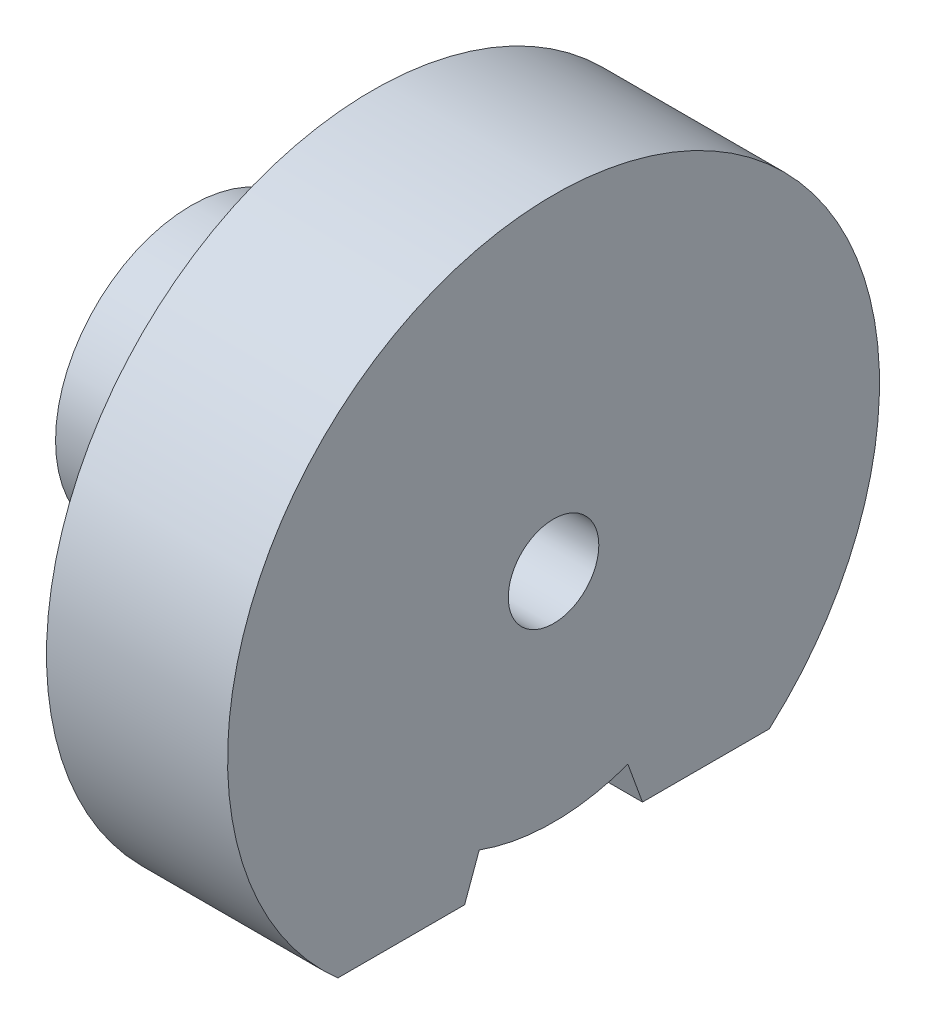
ISO-10303-21;
HEADER;
FILE_DESCRIPTION(('STEP AP214'),'2;1');
FILE_NAME('part.step','',(''),(''),'','','');
FILE_SCHEMA(('AUTOMOTIVE_DESIGN { 1 0 10303 214 1 1 1 1 }'));
ENDSEC;
DATA;
#1=APPLICATION_CONTEXT('core data for automotive mechanical design processes');
#2=APPLICATION_PROTOCOL_DEFINITION('international standard','automotive_design',2000,#1);
#3=PRODUCT_CONTEXT('',#1,'mechanical');
#4=PRODUCT('Part','Part','',(#3));
#5=PRODUCT_RELATED_PRODUCT_CATEGORY('part','',(#4));
#6=PRODUCT_DEFINITION_FORMATION('','',#4);
#7=PRODUCT_DEFINITION_CONTEXT('part definition',#1,'design');
#8=PRODUCT_DEFINITION('design','',#6,#7);
#9=PRODUCT_DEFINITION_SHAPE('','',#8);
#10=(LENGTH_UNIT() NAMED_UNIT(*) SI_UNIT(.MILLI.,.METRE.));
#11=(NAMED_UNIT(*) PLANE_ANGLE_UNIT() SI_UNIT($,.RADIAN.));
#12=(NAMED_UNIT(*) SI_UNIT($,.STERADIAN.) SOLID_ANGLE_UNIT());
#13=UNCERTAINTY_MEASURE_WITH_UNIT(LENGTH_MEASURE(1.E-05),#10,'distance_accuracy_value','');
#14=(GEOMETRIC_REPRESENTATION_CONTEXT(3) GLOBAL_UNCERTAINTY_ASSIGNED_CONTEXT((#13)) GLOBAL_UNIT_ASSIGNED_CONTEXT((#10,
#11,#12)) REPRESENTATION_CONTEXT('',''));
#15=CARTESIAN_POINT('',(0.,0.,0.));
#16=DIRECTION('',(0.,0.,1.));
#17=DIRECTION('',(1.,0.,0.));
#18=AXIS2_PLACEMENT_3D('',#15,#16,#17);
#19=CARTESIAN_POINT('',(-5.,0.,0.));
#20=DIRECTION('',(-1.,0.,0.));
#21=DIRECTION('',(0.,-1.,0.));
#22=AXIS2_PLACEMENT_3D('',#19,#20,#21);
#23=PLANE('',#22);
#24=CARTESIAN_POINT('',(-4.99999999999999,-12.,0.));
#25=DIRECTION('',(-1.,0.,0.));
#26=DIRECTION('',(0.,-1.,0.));
#27=AXIS2_PLACEMENT_3D('',#24,#25,#26);
#28=CIRCLE('',#27,9.5);
#29=CARTESIAN_POINT('',(-4.99999999999999,-21.5,0.));
#30=VERTEX_POINT('',#29);
#31=EDGE_CURVE('E11',#30,#30,#28,.F.);
#32=ORIENTED_EDGE('',*,*,#31,.T.);
#33=EDGE_LOOP('',(#32));
#34=FACE_BOUND('',#33,.T.);
#35=DIRECTION('',(0.,-0.939692620785911,0.342020143325661));
#36=VECTOR('',#35,1.);
#37=CARTESIAN_POINT('',(-5.,-23.276311449431,4.10424171990794));
#38=LINE('',#37,#36);
#39=CARTESIAN_POINT('',(-5.,-23.2763114494309,4.10424171990793));
#40=VERTEX_POINT('',#39);
#41=CARTESIAN_POINT('',(-4.99999999999999,-25.4942657408898,4.91151106296191));
#42=VERTEX_POINT('',#41);
#43=EDGE_CURVE('E123',#40,#42,#38,.T.);
#44=ORIENTED_EDGE('',*,*,#43,.T.);
#45=DIRECTION('',(0.,0.,-1.));
#46=VECTOR('',#45,1.);
#47=CARTESIAN_POINT('',(-4.99999999999999,-25.4942657408898,1.389771851223E-13));
#48=LINE('',#47,#46);
#49=CARTESIAN_POINT('',(-4.99999999999998,-25.4942657408897,11.912379783832));
#50=VERTEX_POINT('',#49);
#51=EDGE_CURVE('E167',#42,#50,#48,.F.);
#52=ORIENTED_EDGE('',*,*,#51,.T.);
#53=CARTESIAN_POINT('',(-4.99999999999998,-12.,0.));
#54=DIRECTION('',(1.,0.,0.));
#55=DIRECTION('',(0.,1.,0.));
#56=AXIS2_PLACEMENT_3D('',#53,#54,#55);
#57=CIRCLE('',#56,18.);
#58=CARTESIAN_POINT('',(-4.99999999999998,-25.4942657408898,-11.912379783832));
#59=VERTEX_POINT('',#58);
#60=EDGE_CURVE('E143',#59,#50,#57,.T.);
#61=ORIENTED_EDGE('',*,*,#60,.F.);
#62=DIRECTION('',(0.,0.,-1.));
#63=VECTOR('',#62,1.);
#64=CARTESIAN_POINT('',(-4.99999999999999,-25.4942657408898,-1.389771851223E-13));
#65=LINE('',#64,#63);
#66=CARTESIAN_POINT('',(-4.99999999999999,-25.4942657408898,-4.91151106296191));
#67=VERTEX_POINT('',#66);
#68=EDGE_CURVE('E160',#59,#67,#65,.F.);
#69=ORIENTED_EDGE('',*,*,#68,.T.);
#70=DIRECTION('',(0.,-0.939692620785911,-0.342020143325661));
#71=VECTOR('',#70,1.);
#72=CARTESIAN_POINT('',(-5.,-23.276311449431,-4.10424171990794));
#73=LINE('',#72,#71);
#74=CARTESIAN_POINT('',(-5.,-23.2763114494309,-4.10424171990793));
#75=VERTEX_POINT('',#74);
#76=EDGE_CURVE('E137',#75,#67,#73,.T.);
#77=ORIENTED_EDGE('',*,*,#76,.F.);
#78=CARTESIAN_POINT('',(-5.,-12.,0.));
#79=DIRECTION('',(1.,0.,0.));
#80=DIRECTION('',(0.,1.,0.));
#81=AXIS2_PLACEMENT_3D('',#78,#79,#80);
#82=CIRCLE('',#81,12.);
#83=EDGE_CURVE('E112',#40,#75,#82,.T.);
#84=ORIENTED_EDGE('',*,*,#83,.F.);
#85=EDGE_LOOP('',(#44,#52,#61,#69,#77,#84));
#86=FACE_BOUND('',#85,.T.);
#87=ADVANCED_FACE('F37',(#34,#86),#23,.T.);
#88=CARTESIAN_POINT('',(5.00000000000001,-12.,0.));
#89=DIRECTION('',(1.,0.,0.));
#90=DIRECTION('',(0.,1.,0.));
#91=AXIS2_PLACEMENT_3D('',#88,#89,#90);
#92=CYLINDRICAL_SURFACE('',#91,12.);
#93=ORIENTED_EDGE('',*,*,#83,.T.);
#94=DIRECTION('',(-1.,0.,0.));
#95=VECTOR('',#94,1.);
#96=CARTESIAN_POINT('',(0.,-23.2763114494309,-4.10424171990793));
#97=LINE('',#96,#95);
#98=CARTESIAN_POINT('',(-1.99999999999999,-23.2763114494309,-4.10424171990793));
#99=VERTEX_POINT('',#98);
#100=EDGE_CURVE('E140',#99,#75,#97,.T.);
#101=ORIENTED_EDGE('',*,*,#100,.F.);
#102=CARTESIAN_POINT('',(-2.,-12.,0.));
#103=DIRECTION('',(1.,0.,0.));
#104=DIRECTION('',(0.,1.,0.));
#105=AXIS2_PLACEMENT_3D('',#102,#103,#104);
#106=CIRCLE('',#105,12.);
#107=CARTESIAN_POINT('',(-1.99999999999999,-23.2763114494309,4.10424171990793));
#108=VERTEX_POINT('',#107);
#109=EDGE_CURVE('E150',#108,#99,#106,.T.);
#110=ORIENTED_EDGE('',*,*,#109,.F.);
#111=DIRECTION('',(-1.,0.,0.));
#112=VECTOR('',#111,1.);
#113=CARTESIAN_POINT('',(0.,-23.2763114494309,4.10424171990793));
#114=LINE('',#113,#112);
#115=EDGE_CURVE('E125',#108,#40,#114,.T.);
#116=ORIENTED_EDGE('',*,*,#115,.T.);
#117=EDGE_LOOP('',(#93,#101,#110,#116));
#118=FACE_BOUND('',#117,.T.);
#119=ADVANCED_FACE('F215',(#118),#92,.T.);
#120=CARTESIAN_POINT('',(5.00000000000001,-12.,0.));
#121=DIRECTION('',(1.,0.,0.));
#122=DIRECTION('',(0.,1.,0.));
#123=AXIS2_PLACEMENT_3D('',#120,#121,#122);
#124=CYLINDRICAL_SURFACE('',#123,12.);
#125=CARTESIAN_POINT('',(2.,-12.,0.));
#126=DIRECTION('',(1.,0.,0.));
#127=DIRECTION('',(0.,1.,0.));
#128=AXIS2_PLACEMENT_3D('',#125,#126,#127);
#129=CIRCLE('',#128,12.);
#130=CARTESIAN_POINT('',(2.00000000000001,-23.2763114494309,4.10424171990793));
#131=VERTEX_POINT('',#130);
#132=CARTESIAN_POINT('',(2.00000000000001,-23.2763114494309,-4.10424171990793));
#133=VERTEX_POINT('',#132);
#134=EDGE_CURVE('E113',#131,#133,#129,.T.);
#135=ORIENTED_EDGE('',*,*,#134,.T.);
#136=DIRECTION('',(-1.,0.,0.));
#137=VECTOR('',#136,1.);
#138=CARTESIAN_POINT('',(0.,-23.2763114494309,-4.10424171990793));
#139=LINE('',#138,#137);
#140=CARTESIAN_POINT('',(5.00000000000001,-23.2763114494309,-4.10424171990793));
#141=VERTEX_POINT('',#140);
#142=EDGE_CURVE('E109',#141,#133,#139,.T.);
#143=ORIENTED_EDGE('',*,*,#142,.F.);
#144=CARTESIAN_POINT('',(5.00000000000001,-12.,0.));
#145=DIRECTION('',(1.,0.,0.));
#146=DIRECTION('',(0.,1.,0.));
#147=AXIS2_PLACEMENT_3D('',#144,#145,#146);
#148=CIRCLE('',#147,12.);
#149=CARTESIAN_POINT('',(5.00000000000001,-23.2763114494309,4.10424171990793));
#150=VERTEX_POINT('',#149);
#151=EDGE_CURVE('E103',#150,#141,#148,.T.);
#152=ORIENTED_EDGE('',*,*,#151,.F.);
#153=DIRECTION('',(-1.,0.,0.));
#154=VECTOR('',#153,1.);
#155=CARTESIAN_POINT('',(0.,-23.2763114494309,4.10424171990793));
#156=LINE('',#155,#154);
#157=EDGE_CURVE('E106',#150,#131,#156,.T.);
#158=ORIENTED_EDGE('',*,*,#157,.T.);
#159=EDGE_LOOP('',(#135,#143,#152,#158));
#160=FACE_BOUND('',#159,.T.);
#161=ADVANCED_FACE('F105',(#160),#124,.T.);
#162=CARTESIAN_POINT('',(0.,-12.,0.));
#163=DIRECTION('',(1.,0.,0.));
#164=DIRECTION('',(0.,1.,0.));
#165=AXIS2_PLACEMENT_3D('',#162,#163,#164);
#166=TOROIDAL_SURFACE('',#165,12.,2.);
#167=ORIENTED_EDGE('',*,*,#109,.T.);
#168=CARTESIAN_POINT('',(0.,-23.2763114494309,-4.10424171990793));
#169=DIRECTION('',(0.,0.342020143325661,-0.939692620785911));
#170=DIRECTION('',(1.,0.,0.));
#171=AXIS2_PLACEMENT_3D('',#168,#169,#170);
#172=CIRCLE('',#171,2.);
#173=EDGE_CURVE('E131',#133,#99,#172,.T.);
#174=ORIENTED_EDGE('',*,*,#173,.F.);
#175=ORIENTED_EDGE('',*,*,#134,.F.);
#176=CARTESIAN_POINT('',(0.,-23.2763114494309,4.10424171990793));
#177=DIRECTION('',(0.,-0.342020143325661,-0.939692620785911));
#178=DIRECTION('',(1.,0.,0.));
#179=AXIS2_PLACEMENT_3D('',#176,#177,#178);
#180=CIRCLE('',#179,2.);
#181=EDGE_CURVE('E120',#131,#108,#180,.T.);
#182=ORIENTED_EDGE('',*,*,#181,.T.);
#183=EDGE_LOOP('',(#167,#174,#175,#182));
#184=FACE_BOUND('',#183,.T.);
#185=ADVANCED_FACE('F214',(#184),#166,.F.);
#186=CARTESIAN_POINT('',(5.00000000000001,0.,0.));
#187=DIRECTION('',(-1.,0.,0.));
#188=DIRECTION('',(0.,-1.,0.));
#189=AXIS2_PLACEMENT_3D('',#186,#187,#188);
#190=PLANE('',#189);
#191=CARTESIAN_POINT('',(5.00000000000001,-12.,0.));
#192=DIRECTION('',(1.,0.,0.));
#193=DIRECTION('',(0.,0.,-1.));
#194=AXIS2_PLACEMENT_3D('',#191,#192,#193);
#195=CIRCLE('',#194,2.5);
#196=CARTESIAN_POINT('',(5.00000000000001,-12.,-2.5));
#197=VERTEX_POINT('',#196);
#198=EDGE_CURVE('E250',#197,#197,#195,.T.);
#199=ORIENTED_EDGE('',*,*,#198,.F.);
#200=EDGE_LOOP('',(#199));
#201=FACE_BOUND('',#200,.T.);
#202=CARTESIAN_POINT('',(4.99999999999999,-12.,0.));
#203=DIRECTION('',(1.,0.,0.));
#204=DIRECTION('',(0.,1.,0.));
#205=AXIS2_PLACEMENT_3D('',#202,#203,#204);
#206=CIRCLE('',#205,18.);
#207=CARTESIAN_POINT('',(5.,-25.4942657408897,-11.912379783832));
#208=VERTEX_POINT('',#207);
#209=CARTESIAN_POINT('',(5.,-25.4942657408897,11.912379783832));
#210=VERTEX_POINT('',#209);
#211=EDGE_CURVE('E146',#208,#210,#206,.T.);
#212=ORIENTED_EDGE('',*,*,#211,.T.);
#213=DIRECTION('',(0.,0.,1.));
#214=VECTOR('',#213,1.);
#215=CARTESIAN_POINT('',(5.00000000000002,-25.4942657408897,11.912379783832));
#216=LINE('',#215,#214);
#217=CARTESIAN_POINT('',(5.00000000000001,-25.4942657408898,4.91151106296191));
#218=VERTEX_POINT('',#217);
#219=EDGE_CURVE('E60',#210,#218,#216,.F.);
#220=ORIENTED_EDGE('',*,*,#219,.T.);
#221=DIRECTION('',(0.,-0.939692620785911,0.342020143325661));
#222=VECTOR('',#221,1.);
#223=CARTESIAN_POINT('',(5.00000000000001,-23.276311449431,4.10424171990794));
#224=LINE('',#223,#222);
#225=EDGE_CURVE('E117',#150,#218,#224,.T.);
#226=ORIENTED_EDGE('',*,*,#225,.F.);
#227=ORIENTED_EDGE('',*,*,#151,.T.);
#228=DIRECTION('',(0.,-0.939692620785911,-0.342020143325661));
#229=VECTOR('',#228,1.);
#230=CARTESIAN_POINT('',(5.00000000000001,-23.2763114494309,-4.10424171990794));
#231=LINE('',#230,#229);
#232=CARTESIAN_POINT('',(5.00000000000001,-25.4942657408898,-4.91151106296192));
#233=VERTEX_POINT('',#232);
#234=EDGE_CURVE('E135',#141,#233,#231,.T.);
#235=ORIENTED_EDGE('',*,*,#234,.T.);
#236=DIRECTION('',(0.,0.,1.));
#237=VECTOR('',#236,1.);
#238=CARTESIAN_POINT('',(5.00000000000002,-25.4942657408898,-4.91151106296192));
#239=LINE('',#238,#237);
#240=EDGE_CURVE('E156',#233,#208,#239,.F.);
#241=ORIENTED_EDGE('',*,*,#240,.T.);
#242=EDGE_LOOP('',(#212,#220,#226,#227,#235,#241));
#243=FACE_BOUND('',#242,.T.);
#244=ADVANCED_FACE('F122',(#201,#243),#190,.F.);
#245=CARTESIAN_POINT('',(5.00000000000001,-12.,0.));
#246=DIRECTION('',(1.,0.,0.));
#247=DIRECTION('',(0.,1.,0.));
#248=AXIS2_PLACEMENT_3D('',#245,#246,#247);
#249=CYLINDRICAL_SURFACE('',#248,18.);
#250=ORIENTED_EDGE('',*,*,#60,.T.);
#251=DIRECTION('',(1.,0.,0.));
#252=VECTOR('',#251,1.);
#253=CARTESIAN_POINT('',(5.00000000000002,-25.4942657408897,11.912379783832));
#254=LINE('',#253,#252);
#255=EDGE_CURVE('E162',#50,#210,#254,.T.);
#256=ORIENTED_EDGE('',*,*,#255,.T.);
#257=ORIENTED_EDGE('',*,*,#211,.F.);
#258=DIRECTION('',(1.,0.,0.));
#259=VECTOR('',#258,1.);
#260=CARTESIAN_POINT('',(5.00000000000002,-25.4942657408897,-11.912379783832));
#261=LINE('',#260,#259);
#262=EDGE_CURVE('E158',#208,#59,#261,.F.);
#263=ORIENTED_EDGE('',*,*,#262,.T.);
#264=EDGE_LOOP('',(#250,#256,#257,#263));
#265=FACE_BOUND('',#264,.T.);
#266=ADVANCED_FACE('F207',(#265),#249,.T.);
#267=CARTESIAN_POINT('',(0.,-23.2763114494309,-4.10424171990793));
#268=DIRECTION('',(0.,0.342020143325661,-0.939692620785911));
#269=DIRECTION('',(1.,0.,0.));
#270=AXIS2_PLACEMENT_3D('',#267,#268,#269);
#271=PLANE('',#270);
#272=ORIENTED_EDGE('',*,*,#76,.T.);
#273=DIRECTION('',(1.,0.,0.));
#274=VECTOR('',#273,1.);
#275=CARTESIAN_POINT('',(0.,-25.4942657408898,-4.91151106296192));
#276=LINE('',#275,#274);
#277=EDGE_CURVE('E153',#67,#233,#276,.T.);
#278=ORIENTED_EDGE('',*,*,#277,.T.);
#279=ORIENTED_EDGE('',*,*,#234,.F.);
#280=ORIENTED_EDGE('',*,*,#142,.T.);
#281=ORIENTED_EDGE('',*,*,#173,.T.);
#282=ORIENTED_EDGE('',*,*,#100,.T.);
#283=EDGE_LOOP('',(#272,#278,#279,#280,#281,#282));
#284=FACE_BOUND('',#283,.T.);
#285=ADVANCED_FACE('F204',(#284),#271,.F.);
#286=CARTESIAN_POINT('',(0.,-23.2763114494309,4.10424171990793));
#287=DIRECTION('',(0.,-0.342020143325661,-0.939692620785911));
#288=DIRECTION('',(1.,0.,0.));
#289=AXIS2_PLACEMENT_3D('',#286,#287,#288);
#290=PLANE('',#289);
#291=ORIENTED_EDGE('',*,*,#225,.T.);
#292=DIRECTION('',(-1.,0.,0.));
#293=VECTOR('',#292,1.);
#294=CARTESIAN_POINT('',(-4.99999999999998,-25.4942657408898,4.91151106296191));
#295=LINE('',#294,#293);
#296=EDGE_CURVE('E52',#218,#42,#295,.T.);
#297=ORIENTED_EDGE('',*,*,#296,.T.);
#298=ORIENTED_EDGE('',*,*,#43,.F.);
#299=ORIENTED_EDGE('',*,*,#115,.F.);
#300=ORIENTED_EDGE('',*,*,#181,.F.);
#301=ORIENTED_EDGE('',*,*,#157,.F.);
#302=EDGE_LOOP('',(#291,#297,#298,#299,#300,#301));
#303=FACE_BOUND('',#302,.T.);
#304=ADVANCED_FACE('F116',(#303),#290,.T.);
#305=CARTESIAN_POINT('',(5.00000000000002,-25.4942657408898,-4.91151106296192));
#306=DIRECTION('',(0.,1.,0.));
#307=DIRECTION('',(1.,0.,0.));
#308=AXIS2_PLACEMENT_3D('',#305,#306,#307);
#309=PLANE('',#308);
#310=ORIENTED_EDGE('',*,*,#68,.F.);
#311=ORIENTED_EDGE('',*,*,#262,.F.);
#312=ORIENTED_EDGE('',*,*,#240,.F.);
#313=ORIENTED_EDGE('',*,*,#277,.F.);
#314=EDGE_LOOP('',(#310,#311,#312,#313));
#315=FACE_BOUND('',#314,.T.);
#316=ADVANCED_FACE('F203',(#315),#309,.F.);
#317=CARTESIAN_POINT('',(5.00000000000002,-25.4942657408897,11.912379783832));
#318=DIRECTION('',(0.,1.,0.));
#319=DIRECTION('',(1.,0.,0.));
#320=AXIS2_PLACEMENT_3D('',#317,#318,#319);
#321=PLANE('',#320);
#322=ORIENTED_EDGE('',*,*,#51,.F.);
#323=ORIENTED_EDGE('',*,*,#296,.F.);
#324=ORIENTED_EDGE('',*,*,#219,.F.);
#325=ORIENTED_EDGE('',*,*,#255,.F.);
#326=EDGE_LOOP('',(#322,#323,#324,#325));
#327=FACE_BOUND('',#326,.T.);
#328=ADVANCED_FACE('F199',(#327),#321,.F.);
#329=CARTESIAN_POINT('',(-4.99999999999999,-12.,0.));
#330=DIRECTION('',(1.,0.,0.));
#331=DIRECTION('',(0.,0.,-1.));
#332=AXIS2_PLACEMENT_3D('',#329,#330,#331);
#333=CYLINDRICAL_SURFACE('',#332,2.5);
#334=CARTESIAN_POINT('',(-11.2312941070925,-12.,-2.5));
#335=CARTESIAN_POINT('',(-11.2312901241958,-11.9351528397911,-2.49999656704197));
#336=CARTESIAN_POINT('',(-11.2261411290485,-11.8702249250713,-2.49744967156655));
#337=CARTESIAN_POINT('',(-11.2057694225696,-11.7422807708933,-2.48751253818898));
#338=CARTESIAN_POINT('',(-11.1905268317456,-11.679268561113,-2.48011274270309));
#339=CARTESIAN_POINT('',(-11.1507048037139,-11.5572033089757,-2.46124586048218));
#340=CARTESIAN_POINT('',(-11.1261612849954,-11.4981360513164,-2.44979443156646));
#341=CARTESIAN_POINT('',(-11.0686163314716,-11.385041704062,-2.42388057536468));
#342=CARTESIAN_POINT('',(-11.0356157294433,-11.3310141189196,-2.4094184445716));
#343=CARTESIAN_POINT('',(-10.9598676395656,-11.2259333024126,-2.37781554127023));
#344=CARTESIAN_POINT('',(-10.9166587189481,-11.1752456161607,-2.36056686576234));
#345=CARTESIAN_POINT('',(-10.8227117435155,-11.0815013577131,-2.32569698663492));
#346=CARTESIAN_POINT('',(-10.7719681841568,-11.0384504155478,-2.3080755188057));
#347=CARTESIAN_POINT('',(-10.6598432092798,-10.9579824649862,-2.27294280900628));
#348=CARTESIAN_POINT('',(-10.5979504038132,-10.9212261282462,-2.2555380367872));
#349=CARTESIAN_POINT('',(-10.4679093750702,-10.8588000753269,-2.22460887291079));
#350=CARTESIAN_POINT('',(-10.3997655606775,-10.8331226169351,-2.21108177365911));
#351=CARTESIAN_POINT('',(-10.2632726934187,-10.7952239543597,-2.19065208347468));
#352=CARTESIAN_POINT('',(-10.1951734851572,-10.7822975486453,-2.18340541330895));
#353=CARTESIAN_POINT('',(-10.0574189808142,-10.7681029376246,-2.1754318407806));
#354=CARTESIAN_POINT('',(-9.98776520317599,-10.7668238157868,-2.17469883343884));
#355=CARTESIAN_POINT('',(-9.85749784037524,-10.7754417363613,-2.17955704738849));
#356=CARTESIAN_POINT('',(-9.7967670013818,-10.7840685732434,-2.18442962254443));
#357=CARTESIAN_POINT('',(-9.67776034146775,-10.8100596096986,-2.19869492601742));
#358=CARTESIAN_POINT('',(-9.61948527043609,-10.8274264574525,-2.20808902429631));
#359=CARTESIAN_POINT('',(-9.50538551141401,-10.8707282635915,-2.23054910161542));
#360=CARTESIAN_POINT('',(-9.44964967307013,-10.8968536089889,-2.24369560984469));
#361=CARTESIAN_POINT('',(-9.34308910226222,-10.9567864371918,-2.27218071126912));
#362=CARTESIAN_POINT('',(-9.29226658383036,-10.9905973604738,-2.28752028505335));
#363=CARTESIAN_POINT('',(-9.19041829647949,-11.0697761924831,-2.32093640367294));
#364=CARTESIAN_POINT('',(-9.14013084594206,-11.1160526066259,-2.33911799117271));
#365=CARTESIAN_POINT('',(-9.04772830366283,-11.2164683822887,-2.37463993110615));
#366=CARTESIAN_POINT('',(-9.00561689797445,-11.2706112711544,-2.39197990147876));
#367=CARTESIAN_POINT('',(-8.92903530046886,-11.3882370401435,-2.42479479725062));
#368=CARTESIAN_POINT('',(-8.8949807951723,-11.452025228457,-2.44015470432386));
#369=CARTESIAN_POINT('',(-8.83836074844805,-11.5853740390151,-2.46631040326702));
#370=CARTESIAN_POINT('',(-8.81578634081179,-11.654930158184,-2.47710971623852));
#371=CARTESIAN_POINT('',(-8.78457770679286,-11.7917859767498,-2.49218705650747));
#372=CARTESIAN_POINT('',(-8.77496083613897,-11.8588106838732,-2.49692319623963));
#373=CARTESIAN_POINT('',(-8.76687281433764,-11.9936802804409,-2.50090043923584));
#374=CARTESIAN_POINT('',(-8.7683966140876,-12.0615247844253,-2.50014403179767));
#375=CARTESIAN_POINT('',(-8.78196342480554,-12.1907237193863,-2.49349136179115));
#376=CARTESIAN_POINT('',(-8.79321211955052,-12.2521843708092,-2.48798328100881));
#377=CARTESIAN_POINT('',(-8.82467732197215,-12.3722273524786,-2.47287450777059));
#378=CARTESIAN_POINT('',(-8.84489483171276,-12.4308093602887,-2.46327335801072));
#379=CARTESIAN_POINT('',(-8.89427609384633,-12.5454057544827,-2.44050141699756));
#380=CARTESIAN_POINT('',(-8.92368374336833,-12.6012952901331,-2.42723461530798));
#381=CARTESIAN_POINT('',(-8.99033830752645,-12.707534993755,-2.39842215783908));
#382=CARTESIAN_POINT('',(-9.02758860122501,-12.7578827597279,-2.3828755206545));
#383=CARTESIAN_POINT('',(-9.11300041159297,-12.8567277799263,-2.34925460493631));
#384=CARTESIAN_POINT('',(-9.1618658566916,-12.9045841460562,-2.33108092028442));
#385=CARTESIAN_POINT('',(-9.26700100850249,-12.9916967902682,-2.29537762005792));
#386=CARTESIAN_POINT('',(-9.32327542534282,-13.0309475548189,-2.27784842335124));
#387=CARTESIAN_POINT('',(-9.44482076571775,-13.1013663947271,-2.24467746175691));
#388=CARTESIAN_POINT('',(-9.5103808821693,-13.1320962335189,-2.22915464716486));
#389=CARTESIAN_POINT('',(-9.64675552235181,-13.1817580634637,-2.20323503115541));
#390=CARTESIAN_POINT('',(-9.71756335331078,-13.2007048022025,-2.19283182551627));
#391=CARTESIAN_POINT('',(-9.85522006386984,-13.224552925951,-2.17959616211255));
#392=CARTESIAN_POINT('',(-9.92180629394613,-13.2306173052629,-2.17613854360095));
#393=CARTESIAN_POINT('',(-10.0551020844349,-13.231862642563,-2.17543502288224));
#394=CARTESIAN_POINT('',(-10.1218115861734,-13.2270478718986,-2.17818668280168));
#395=CARTESIAN_POINT('',(-10.2471487194458,-13.2077505001154,-2.18893591232599));
#396=CARTESIAN_POINT('',(-10.3059637652844,-13.1941759471964,-2.1964396372237));
#397=CARTESIAN_POINT('',(-10.4204259344096,-13.1588431173589,-2.2152835273299));
#398=CARTESIAN_POINT('',(-10.4760720544089,-13.1370822650474,-2.22662489974137));
#399=CARTESIAN_POINT('',(-10.5867519931912,-13.0843501305916,-2.25279931595055));
#400=CARTESIAN_POINT('',(-10.6414929356387,-13.0528578339005,-2.26781589133098));
#401=CARTESIAN_POINT('',(-10.7452671554687,-12.982145155332,-2.29932356714277));
#402=CARTESIAN_POINT('',(-10.7942974962899,-12.9429208250814,-2.31581541856581));
#403=CARTESIAN_POINT('',(-10.8911978621174,-12.8524897198013,-2.3507174154063));
#404=CARTESIAN_POINT('',(-10.9382663132541,-12.8004191391443,-2.36912706598559));
#405=CARTESIAN_POINT('',(-11.0231645439666,-12.6885837833065,-2.40401344117279));
#406=CARTESIAN_POINT('',(-11.0609895107651,-12.6288150245637,-2.42048915653439));
#407=CARTESIAN_POINT('',(-11.12625239026,-12.5026944339533,-2.44979691315219));
#408=CARTESIAN_POINT('',(-11.1536492794418,-12.4363178722962,-2.46261451513558));
#409=CARTESIAN_POINT('',(-11.1965418772232,-12.2991699838329,-2.48299543761101));
#410=CARTESIAN_POINT('',(-11.2120717998645,-12.2284119319989,-2.49057385729625));
#411=CARTESIAN_POINT('',(-11.2246087625881,-12.1307998676647,-2.49671318775856));
#412=CARTESIAN_POINT('',(-11.2271124292175,-12.1047227119582,-2.4979427154108));
#413=CARTESIAN_POINT('',(-11.2304559293061,-12.052434775344,-2.49958682669122));
#414=CARTESIAN_POINT('',(-11.2312957177636,-12.0262239908414,-2.5000013882776));
#415=CARTESIAN_POINT('',(-11.2312941070925,-12.,-2.5));
#416=B_SPLINE_CURVE_WITH_KNOTS('',3,(#334,#335,#336,#337,#338,#339,#340,#341,#342,#343,#344,
#345,#346,#347,#348,#349,#350,#351,#352,#353,#354,#355,#356,#357,#358,#359,#360,#361,#362,#363,
#364,#365,#366,#367,#368,#369,#370,#371,#372,#373,#374,#375,#376,#377,#378,#379,#380,#381,#382,
#383,#384,#385,#386,#387,#388,#389,#390,#391,#392,#393,#394,#395,#396,#397,#398,#399,#400,#401,
#402,#403,#404,#405,#406,#407,#408,#409,#410,#411,#412,#413,#414,#415),.UNSPECIFIED.,.T.,.F.,(4,
2,2,2,2,2,2,2,2,2,2,2,2,2,2,2,2,2,2,2,2,2,2,2,2,2,2,2,2,2,2,2,2,2,2,2,2,2,2,2,4),(0.,
0.194434911441647,0.389253908948672,0.583328093850886,0.777383175421312,0.982928722481212,
1.18862517956977,1.40968014884301,1.6305803878761,1.83843340515401,2.04609159006784,
2.22983353124614,2.41363117888684,2.60171553620157,2.78988425654649,3.00111226436418,
3.21243528131291,3.43301822162333,3.65343054353893,3.85595515470343,4.05838798466492,
4.2456985509412,4.4330300502455,4.62582934011477,4.81871186963501,5.03009828915465,
5.24161974882706,5.46256908627696,5.68324132671581,5.88295646397514,6.08259320315355,
6.26428265221899,6.44602930827523,6.63999923553493,6.83406847159009,7.05076134316335,
7.26756680032099,7.48521655429585,7.70223640244509,7.78086315218984,7.85949202846559),.UNSPECIFIED.);
#417=CARTESIAN_POINT('',(-11.2312941070925,-12.,-2.5));
#418=VERTEX_POINT('',#417);
#419=EDGE_CURVE('E176',#418,#418,#416,.T.);
#420=ORIENTED_EDGE('',*,*,#419,.T.);
#421=EDGE_LOOP('',(#420));
#422=FACE_BOUND('',#421,.T.);
#423=ORIENTED_EDGE('',*,*,#198,.T.);
#424=EDGE_LOOP('',(#423));
#425=FACE_BOUND('',#424,.T.);
#426=CARTESIAN_POINT('',(-15.,-12.,0.));
#427=DIRECTION('',(-1.,0.,0.));
#428=DIRECTION('',(0.,0.,1.));
#429=AXIS2_PLACEMENT_3D('',#426,#427,#428);
#430=CIRCLE('',#429,2.5);
#431=CARTESIAN_POINT('',(-15.,-12.,2.5));
#432=VERTEX_POINT('',#431);
#433=EDGE_CURVE('E193',#432,#432,#430,.T.);
#434=ORIENTED_EDGE('',*,*,#433,.T.);
#435=EDGE_LOOP('',(#434));
#436=FACE_BOUND('',#435,.T.);
#437=ADVANCED_FACE('F195',(#422,#425,#436),#333,.F.);
#438=CARTESIAN_POINT('',(-15.,-12.,0.));
#439=DIRECTION('',(-1.,0.,0.));
#440=DIRECTION('',(0.,0.,1.));
#441=AXIS2_PLACEMENT_3D('',#438,#439,#440);
#442=PLANE('',#441);
#443=CARTESIAN_POINT('',(-15.,-12.,0.));
#444=DIRECTION('',(-1.,0.,0.));
#445=DIRECTION('',(0.,0.,1.));
#446=AXIS2_PLACEMENT_3D('',#443,#444,#445);
#447=CIRCLE('',#446,7.5);
#448=CARTESIAN_POINT('',(-15.,-12.,7.5));
#449=VERTEX_POINT('',#448);
#450=EDGE_CURVE('E252',#449,#449,#447,.T.);
#451=ORIENTED_EDGE('',*,*,#450,.T.);
#452=EDGE_LOOP('',(#451));
#453=FACE_BOUND('',#452,.T.);
#454=ORIENTED_EDGE('',*,*,#433,.F.);
#455=EDGE_LOOP('',(#454));
#456=FACE_BOUND('',#455,.T.);
#457=ADVANCED_FACE('F185',(#453,#456),#442,.T.);
#458=CARTESIAN_POINT('',(-15.,-12.,0.));
#459=DIRECTION('',(1.,0.,0.));
#460=DIRECTION('',(0.,0.,-1.));
#461=AXIS2_PLACEMENT_3D('',#458,#459,#460);
#462=CYLINDRICAL_SURFACE('',#461,7.5);
#463=CARTESIAN_POINT('',(-7.,-12.,0.));
#464=DIRECTION('',(-1.,0.,0.));
#465=DIRECTION('',(0.,-1.,0.));
#466=AXIS2_PLACEMENT_3D('',#463,#464,#465);
#467=CIRCLE('',#466,7.5);
#468=CARTESIAN_POINT('',(-6.99999999999999,-19.5,0.));
#469=VERTEX_POINT('',#468);
#470=EDGE_CURVE('E45',#469,#469,#467,.T.);
#471=ORIENTED_EDGE('',*,*,#470,.T.);
#472=EDGE_LOOP('',(#471));
#473=FACE_BOUND('',#472,.T.);
#474=CARTESIAN_POINT('',(-11.2312941070925,-12.,-7.5));
#475=CARTESIAN_POINT('',(-11.2312913408041,-12.0686674704559,-7.49999883368851));
#476=CARTESIAN_POINT('',(-11.2255304780842,-12.1373727871285,-7.49904712330866));
#477=CARTESIAN_POINT('',(-11.2026482341597,-12.2728574731562,-7.49534219922471));
#478=CARTESIAN_POINT('',(-11.1855163102089,-12.3396349951333,-7.49258731372906));
#479=CARTESIAN_POINT('',(-11.1404223015982,-12.4692842170707,-7.48558512848709));
#480=CARTESIAN_POINT('',(-11.1124689715226,-12.5321590267604,-7.48133903539395));
#481=CARTESIAN_POINT('',(-11.0465483316764,-12.6523176496309,-7.47182166734669));
#482=CARTESIAN_POINT('',(-11.0085822052904,-12.7096021224228,-7.46655051356097));
#483=CARTESIAN_POINT('',(-10.923338488595,-12.81749429367,-7.45551290990558));
#484=CARTESIAN_POINT('',(-10.875986124505,-12.868042537077,-7.4497427073179));
#485=CARTESIAN_POINT('',(-10.7734750333665,-12.9605138884571,-7.43838616782445));
#486=CARTESIAN_POINT('',(-10.7183158209487,-13.0024364597548,-7.43279984237737));
#487=CARTESIAN_POINT('',(-10.6013497666477,-13.0767036538073,-7.42240720767618));
#488=CARTESIAN_POINT('',(-10.5395052508497,-13.1089896803098,-7.41760574764584));
#489=CARTESIAN_POINT('',(-10.4111788203008,-13.1626926279392,-7.40937841962743));
#490=CARTESIAN_POINT('',(-10.3446972095808,-13.1841102608912,-7.405952461554));
#491=CARTESIAN_POINT('',(-10.2096132438736,-13.2152815415651,-7.40090132149625));
#492=CARTESIAN_POINT('',(-10.14103514713,-13.2251377035635,-7.399260322095));
#493=CARTESIAN_POINT('',(-10.0031803857831,-13.2332240665584,-7.39791702428287));
#494=CARTESIAN_POINT('',(-9.93390376947945,-13.231455065953,-7.39821459273414));
#495=CARTESIAN_POINT('',(-9.79734908549419,-13.2164248631515,-7.4007003641532));
#496=CARTESIAN_POINT('',(-9.73005796492866,-13.2032786670484,-7.40286964629076));
#497=CARTESIAN_POINT('',(-9.59864964409714,-13.1660476588291,-7.40882481346692));
#498=CARTESIAN_POINT('',(-9.53453254981254,-13.1419624817309,-7.41261075244544));
#499=CARTESIAN_POINT('',(-9.41094716218102,-13.0834201323703,-7.42139316416902));
#500=CARTESIAN_POINT('',(-9.35150197377877,-13.0489150545022,-7.42639520680529));
#501=CARTESIAN_POINT('',(-9.23920170288281,-12.9705464048452,-7.43704233020293));
#502=CARTESIAN_POINT('',(-9.18634713733572,-12.9266820996801,-7.44268746133965));
#503=CARTESIAN_POINT('',(-9.08806262109425,-12.8302128023408,-7.45406790712134));
#504=CARTESIAN_POINT('',(-9.04272952844852,-12.7775091043279,-7.45980349027784));
#505=CARTESIAN_POINT('',(-8.96153596879207,-12.6651913174992,-7.47065582933115));
#506=CARTESIAN_POINT('',(-8.92567555949987,-12.6055771865802,-7.47577258145722));
#507=CARTESIAN_POINT('',(-8.8644370982134,-12.481040800232,-7.48481769251401));
#508=CARTESIAN_POINT('',(-8.83906743345016,-12.4161143471422,-7.48874509990832));
#509=CARTESIAN_POINT('',(-8.79961961190767,-12.2828433361479,-7.49496132268265));
#510=CARTESIAN_POINT('',(-8.78554053893182,-12.2144990560677,-7.49725027101693));
#511=CARTESIAN_POINT('',(-8.76920446554526,-12.0771674359585,-7.4999138371798));
#512=CARTESIAN_POINT('',(-8.7668144687876,-12.0081963192563,-7.50030998971818));
#513=CARTESIAN_POINT('',(-8.77357006112559,-11.8708390083157,-7.49920225395316));
#514=CARTESIAN_POINT('',(-8.78271521999501,-11.8024527923581,-7.49769843651285));
#515=CARTESIAN_POINT('',(-8.81217091054439,-11.6686160759298,-7.49297306192906));
#516=CARTESIAN_POINT('',(-8.83241576181806,-11.6031507323986,-7.48976161272531));
#517=CARTESIAN_POINT('',(-8.88342626039474,-11.4765433156329,-7.48197966730186));
#518=CARTESIAN_POINT('',(-8.91419248384776,-11.4154014793749,-7.4774090966585));
#519=CARTESIAN_POINT('',(-8.98567814531913,-11.2985978662792,-7.46736265284861));
#520=CARTESIAN_POINT('',(-9.02648086141112,-11.2429877094382,-7.46187933598848));
#521=CARTESIAN_POINT('',(-9.11676649553186,-11.1393564757383,-7.45063854890679));
#522=CARTESIAN_POINT('',(-9.1662500241871,-11.0913359332007,-7.44488105942013));
#523=CARTESIAN_POINT('',(-9.27308843752664,-11.0037554757939,-7.43367140911067));
#524=CARTESIAN_POINT('',(-9.33051733723835,-10.9642853114123,-7.42822289259931));
#525=CARTESIAN_POINT('',(-9.45126840297594,-10.8955523746664,-7.41831560210183));
#526=CARTESIAN_POINT('',(-9.51459038618722,-10.8662892857929,-7.41385679742751));
#527=CARTESIAN_POINT('',(-9.64507659344995,-10.8189361656093,-7.40646097130058));
#528=CARTESIAN_POINT('',(-9.7122240981066,-10.8008010630211,-7.40351781895464));
#529=CARTESIAN_POINT('',(-9.84866441739465,-10.7760766088713,-7.39947100745461));
#530=CARTESIAN_POINT('',(-9.91795705108881,-10.7694862862168,-7.39836719358436));
#531=CARTESIAN_POINT('',(-10.0558247107642,-10.768064930997,-7.39813056794275));
#532=CARTESIAN_POINT('',(-10.1243982810011,-10.7730926525747,-7.39897408150534));
#533=CARTESIAN_POINT('',(-10.2597098169442,-10.7944596744551,-7.40248524951472));
#534=CARTESIAN_POINT('',(-10.3264477880963,-10.8107989411945,-7.40515289854898));
#535=CARTESIAN_POINT('',(-10.4561414661467,-10.8542717716209,-7.41200287551555));
#536=CARTESIAN_POINT('',(-10.5191012233063,-10.8813935296092,-7.41618354639994));
#537=CARTESIAN_POINT('',(-10.6395997541834,-10.9456470235826,-7.42559017672045));
#538=CARTESIAN_POINT('',(-10.6971382719946,-10.9827792317862,-7.43081618546482));
#539=CARTESIAN_POINT('',(-10.8058752684921,-11.0665050977482,-7.44179987535172));
#540=CARTESIAN_POINT('',(-10.8569931112918,-11.1132027816712,-7.44756298581195));
#541=CARTESIAN_POINT('',(-10.9507157659494,-11.2145145484887,-7.4589279047257));
#542=CARTESIAN_POINT('',(-10.9933186086617,-11.2691304574943,-7.46452967561269));
#543=CARTESIAN_POINT('',(-11.0690612409323,-11.3851614400874,-7.47498403178149));
#544=CARTESIAN_POINT('',(-11.1021359029479,-11.4466195030518,-7.47983136144601));
#545=CARTESIAN_POINT('',(-11.1574413644121,-11.5742730971564,-7.48817948615971));
#546=CARTESIAN_POINT('',(-11.1796830313333,-11.6404638038054,-7.49168162992717));
#547=CARTESIAN_POINT('',(-11.2078293684586,-11.7557650790872,-7.49617502575993));
#548=CARTESIAN_POINT('',(-11.2166146545424,-11.8041758172389,-7.49760177139862));
#549=CARTESIAN_POINT('',(-11.2283479659861,-11.9017179147809,-7.49951466821106));
#550=CARTESIAN_POINT('',(-11.2312960871439,-11.9508492623314,-7.50000083482134));
#551=CARTESIAN_POINT('',(-11.2312941070925,-12.,-7.5));
#552=B_SPLINE_CURVE_WITH_KNOTS('',3,(#474,#475,#476,#477,#478,#479,#480,#481,#482,#483,#484,
#485,#486,#487,#488,#489,#490,#491,#492,#493,#494,#495,#496,#497,#498,#499,#500,#501,#502,#503,
#504,#505,#506,#507,#508,#509,#510,#511,#512,#513,#514,#515,#516,#517,#518,#519,#520,#521,#522,
#523,#524,#525,#526,#527,#528,#529,#530,#531,#532,#533,#534,#535,#536,#537,#538,#539,#540,#541,
#542,#543,#544,#545,#546,#547,#548,#549,#550,#551),.UNSPECIFIED.,.T.,.F.,(4,2,2,2,2,2,2,2,2,2,2,
2,2,2,2,2,2,2,2,2,2,2,2,2,2,2,2,2,2,2,2,2,2,2,2,2,2,2,4),(0.,0.205822760306533,
0.411836617460353,0.617684155261535,0.823507375405553,1.03104139690288,1.23858832693009,
1.44737270049396,1.65614339797012,1.86304861029599,2.06993961284187,2.2747633713035,
2.47959396426526,2.68538098810598,2.8911841430592,3.09946052481408,3.30773817559973,
3.51618202155309,3.72460895122102,3.93065882737358,4.13670101871928,4.34153694922918,
4.54638409834496,4.75299197433284,4.95961438938195,5.16831053137869,5.37700020138253,
5.58483894566824,5.79266020669256,5.99796820395923,6.20327559204244,6.40835880640031,
6.61345169674785,6.82090625857393,7.02840874016379,7.23729761355693,7.44597649942166,
7.593302539855,7.74062616239243),.UNSPECIFIED.);
#553=CARTESIAN_POINT('',(-11.2312941070925,-12.,-7.5));
#554=VERTEX_POINT('',#553);
#555=EDGE_CURVE('E169',#554,#554,#552,.T.);
#556=ORIENTED_EDGE('',*,*,#555,.T.);
#557=EDGE_LOOP('',(#556));
#558=FACE_BOUND('',#557,.T.);
#559=ORIENTED_EDGE('',*,*,#450,.F.);
#560=EDGE_LOOP('',(#559));
#561=FACE_BOUND('',#560,.T.);
#562=ADVANCED_FACE('F177',(#473,#558,#561),#462,.T.);
#563=CARTESIAN_POINT('',(-10.,-12.,-10.));
#564=DIRECTION('',(0.,0.,1.));
#565=DIRECTION('',(1.,0.,0.));
#566=AXIS2_PLACEMENT_3D('',#563,#564,#565);
#567=CYLINDRICAL_SURFACE('',#566,1.23129410709255);
#568=ORIENTED_EDGE('',*,*,#555,.F.);
#569=EDGE_LOOP('',(#568));
#570=FACE_BOUND('',#569,.T.);
#571=ORIENTED_EDGE('',*,*,#419,.F.);
#572=EDGE_LOOP('',(#571));
#573=FACE_BOUND('',#572,.T.);
#574=ADVANCED_FACE('F181',(#570,#573),#567,.F.);
#575=CARTESIAN_POINT('',(-7.,-12.,0.));
#576=DIRECTION('',(-1.,0.,0.));
#577=DIRECTION('',(0.,-1.,0.));
#578=AXIS2_PLACEMENT_3D('',#575,#576,#577);
#579=TOROIDAL_SURFACE('',#578,9.5,2.);
#580=ORIENTED_EDGE('',*,*,#31,.F.);
#581=EDGE_LOOP('',(#580));
#582=FACE_BOUND('',#581,.T.);
#583=ORIENTED_EDGE('',*,*,#470,.F.);
#584=EDGE_LOOP('',(#583));
#585=FACE_BOUND('',#584,.T.);
#586=ADVANCED_FACE('F39',(#582,#585),#579,.F.);
#587=CLOSED_SHELL('',(#87,#119,#161,#185,#244,#266,#285,#304,#316,#328,#437,#457,#562,#574,#586));
#588=MANIFOLD_SOLID_BREP('B2',#587);
#589=ADVANCED_BREP_SHAPE_REPRESENTATION('',(#18,#588),#14);
#590=SHAPE_DEFINITION_REPRESENTATION(#9,#589);
ENDSEC;
END-ISO-10303-21;
